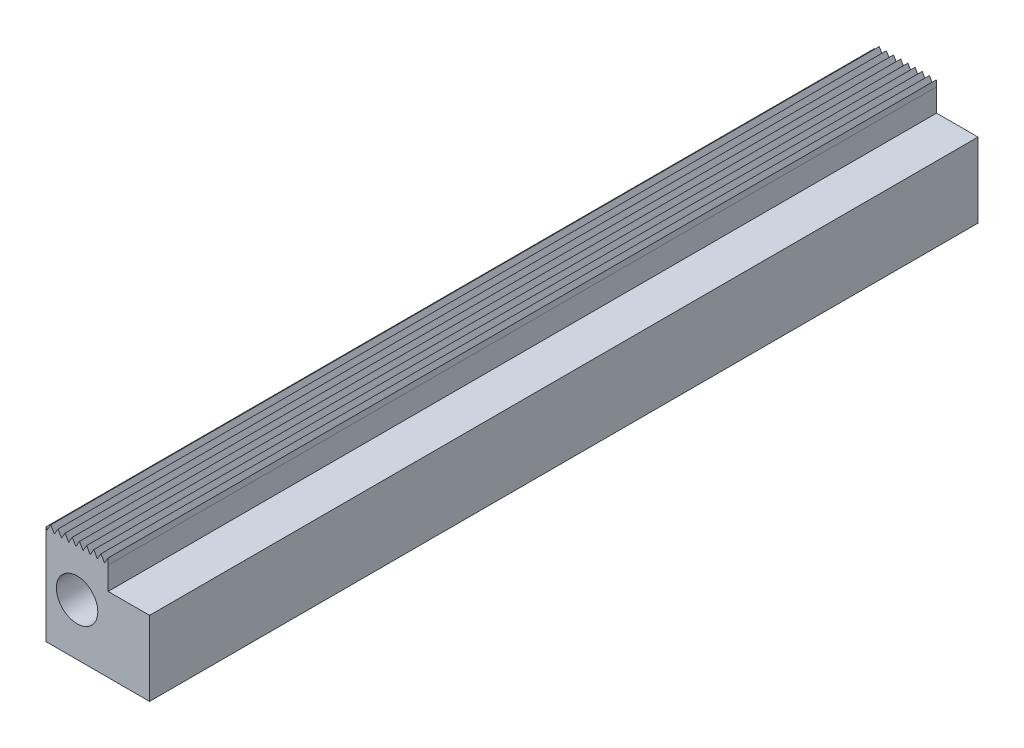
ISO-10303-21;
HEADER;
FILE_DESCRIPTION(('STEP AP214'),'2;1');
FILE_NAME('part.step','',(''),(''),'','','');
FILE_SCHEMA(('AUTOMOTIVE_DESIGN { 1 0 10303 214 1 1 1 1 }'));
ENDSEC;
DATA;
#1=APPLICATION_CONTEXT('core data for automotive mechanical design processes');
#2=APPLICATION_PROTOCOL_DEFINITION('international standard','automotive_design',2000,#1);
#3=PRODUCT_CONTEXT('',#1,'mechanical');
#4=PRODUCT('Part','Part','',(#3));
#5=PRODUCT_RELATED_PRODUCT_CATEGORY('part','',(#4));
#6=PRODUCT_DEFINITION_FORMATION('','',#4);
#7=PRODUCT_DEFINITION_CONTEXT('part definition',#1,'design');
#8=PRODUCT_DEFINITION('design','',#6,#7);
#9=PRODUCT_DEFINITION_SHAPE('','',#8);
#10=(LENGTH_UNIT() NAMED_UNIT(*) SI_UNIT(.MILLI.,.METRE.));
#11=(NAMED_UNIT(*) PLANE_ANGLE_UNIT() SI_UNIT($,.RADIAN.));
#12=(NAMED_UNIT(*) SI_UNIT($,.STERADIAN.) SOLID_ANGLE_UNIT());
#13=UNCERTAINTY_MEASURE_WITH_UNIT(LENGTH_MEASURE(1.E-05),#10,'distance_accuracy_value','');
#14=(GEOMETRIC_REPRESENTATION_CONTEXT(3) GLOBAL_UNCERTAINTY_ASSIGNED_CONTEXT((#13)) GLOBAL_UNIT_ASSIGNED_CONTEXT((#10,
#11,#12)) REPRESENTATION_CONTEXT('',''));
#15=CARTESIAN_POINT('',(0.,0.,0.));
#16=DIRECTION('',(0.,0.,1.));
#17=DIRECTION('',(1.,0.,0.));
#18=AXIS2_PLACEMENT_3D('',#15,#16,#17);
#19=CARTESIAN_POINT('',(-3.5384278264922,2.04291225813333,200.));
#20=DIRECTION('',(0.866025403784439,-0.5,0.));
#21=DIRECTION('',(0.5,0.866025403784439,0.));
#22=AXIS2_PLACEMENT_3D('',#19,#20,#21);
#23=PLANE('',#22);
#24=DIRECTION('',(-0.5,-0.866025403784439,0.));
#25=VECTOR('',#24,1.);
#26=CARTESIAN_POINT('',(-3.5384278264922,2.04291225813333,0.));
#27=LINE('',#26,#25);
#28=CARTESIAN_POINT('',(2.49897459621371,12.4999999999994,0.));
#29=VERTEX_POINT('',#28);
#30=CARTESIAN_POINT('',(1.63397459621381,11.0017760514525,0.));
#31=VERTEX_POINT('',#30);
#32=EDGE_CURVE('E234',#29,#31,#27,.T.);
#33=ORIENTED_EDGE('',*,*,#32,.T.);
#34=DIRECTION('',(0.,0.,-1.));
#35=VECTOR('',#34,1.);
#36=CARTESIAN_POINT('',(1.63397459621381,11.0017760514525,200.));
#37=LINE('',#36,#35);
#38=CARTESIAN_POINT('',(1.63397459621381,11.0017760514525,200.));
#39=VERTEX_POINT('',#38);
#40=EDGE_CURVE('E11',#39,#31,#37,.T.);
#41=ORIENTED_EDGE('',*,*,#40,.F.);
#42=DIRECTION('',(-0.5,-0.866025403784439,0.));
#43=VECTOR('',#42,1.);
#44=CARTESIAN_POINT('',(-3.5384278264922,2.04291225813333,200.));
#45=LINE('',#44,#43);
#46=CARTESIAN_POINT('',(2.49897459621371,12.4999999999994,200.));
#47=VERTEX_POINT('',#46);
#48=EDGE_CURVE('E288',#47,#39,#45,.T.);
#49=ORIENTED_EDGE('',*,*,#48,.F.);
#50=DIRECTION('',(0.,0.,-1.));
#51=VECTOR('',#50,1.);
#52=CARTESIAN_POINT('',(2.49897459621371,12.4999999999994,200.));
#53=LINE('',#52,#51);
#54=EDGE_CURVE('E52',#47,#29,#53,.T.);
#55=ORIENTED_EDGE('',*,*,#54,.T.);
#56=EDGE_LOOP('',(#33,#41,#49,#55));
#57=FACE_BOUND('',#56,.T.);
#58=ADVANCED_FACE('F36',(#57),#23,.F.);
#59=CARTESIAN_POINT('',(5.98938972081292,3.45797576759291,200.));
#60=DIRECTION('',(-0.866025403784439,-0.5,0.));
#61=DIRECTION('',(0.5,-0.866025403784439,0.));
#62=AXIS2_PLACEMENT_3D('',#59,#60,#61);
#63=PLANE('',#62);
#64=DIRECTION('',(-0.5,0.866025403784439,0.));
#65=VECTOR('',#64,1.);
#66=CARTESIAN_POINT('',(5.98938972081292,3.45797576759291,0.));
#67=LINE('',#66,#65);
#68=CARTESIAN_POINT('',(0.768974596213909,12.4999999999994,0.));
#69=VERTEX_POINT('',#68);
#70=EDGE_CURVE('E236',#31,#69,#67,.T.);
#71=ORIENTED_EDGE('',*,*,#70,.T.);
#72=DIRECTION('',(0.,0.,-1.));
#73=VECTOR('',#72,1.);
#74=CARTESIAN_POINT('',(0.768974596213909,12.4999999999994,200.));
#75=LINE('',#74,#73);
#76=CARTESIAN_POINT('',(0.768974596213909,12.4999999999994,200.));
#77=VERTEX_POINT('',#76);
#78=EDGE_CURVE('E44',#77,#69,#75,.T.);
#79=ORIENTED_EDGE('',*,*,#78,.F.);
#80=DIRECTION('',(-0.5,0.866025403784439,0.));
#81=VECTOR('',#80,1.);
#82=CARTESIAN_POINT('',(5.98938972081292,3.45797576759291,200.));
#83=LINE('',#82,#81);
#84=EDGE_CURVE('E139',#39,#77,#83,.T.);
#85=ORIENTED_EDGE('',*,*,#84,.F.);
#86=ORIENTED_EDGE('',*,*,#40,.T.);
#87=EDGE_LOOP('',(#71,#79,#85,#86));
#88=FACE_BOUND('',#87,.T.);
#89=ADVANCED_FACE('F420',(#88),#63,.F.);
#90=CARTESIAN_POINT('',(-4.83592782649206,2.79202423240679,200.));
#91=DIRECTION('',(0.866025403784439,-0.5,0.));
#92=DIRECTION('',(0.5,0.866025403784439,0.));
#93=AXIS2_PLACEMENT_3D('',#90,#91,#92);
#94=PLANE('',#93);
#95=DIRECTION('',(-0.5,-0.866025403784439,0.));
#96=VECTOR('',#95,1.);
#97=CARTESIAN_POINT('',(-4.83592782649206,2.79202423240679,0.));
#98=LINE('',#97,#96);
#99=CARTESIAN_POINT('',(-0.0960254037859947,11.0017760514525,0.));
#100=VERTEX_POINT('',#99);
#101=EDGE_CURVE('E238',#69,#100,#98,.T.);
#102=ORIENTED_EDGE('',*,*,#101,.T.);
#103=DIRECTION('',(0.,0.,-1.));
#104=VECTOR('',#103,1.);
#105=CARTESIAN_POINT('',(-0.0960254037859947,11.0017760514525,200.));
#106=LINE('',#105,#104);
#107=CARTESIAN_POINT('',(-0.0960254037859947,11.0017760514525,200.));
#108=VERTEX_POINT('',#107);
#109=EDGE_CURVE('E341',#108,#100,#106,.T.);
#110=ORIENTED_EDGE('',*,*,#109,.F.);
#111=DIRECTION('',(-0.5,-0.866025403784439,0.));
#112=VECTOR('',#111,1.);
#113=CARTESIAN_POINT('',(-4.83592782649206,2.79202423240679,200.));
#114=LINE('',#113,#112);
#115=EDGE_CURVE('E349',#77,#108,#114,.T.);
#116=ORIENTED_EDGE('',*,*,#115,.F.);
#117=ORIENTED_EDGE('',*,*,#78,.T.);
#118=EDGE_LOOP('',(#102,#110,#116,#117));
#119=FACE_BOUND('',#118,.T.);
#120=ADVANCED_FACE('F347',(#119),#94,.F.);
#121=CARTESIAN_POINT('',(4.69188972081306,2.70886379331946,200.));
#122=DIRECTION('',(-0.866025403784439,-0.5,0.));
#123=DIRECTION('',(0.5,-0.866025403784439,0.));
#124=AXIS2_PLACEMENT_3D('',#121,#122,#123);
#125=PLANE('',#124);
#126=DIRECTION('',(-0.5,0.866025403784439,0.));
#127=VECTOR('',#126,1.);
#128=CARTESIAN_POINT('',(4.69188972081306,2.70886379331946,0.));
#129=LINE('',#128,#127);
#130=CARTESIAN_POINT('',(-0.961025403785894,12.4999999999994,0.));
#131=VERTEX_POINT('',#130);
#132=EDGE_CURVE('E240',#100,#131,#129,.T.);
#133=ORIENTED_EDGE('',*,*,#132,.T.);
#134=DIRECTION('',(0.,0.,-1.));
#135=VECTOR('',#134,1.);
#136=CARTESIAN_POINT('',(-0.961025403785894,12.4999999999994,200.));
#137=LINE('',#136,#135);
#138=CARTESIAN_POINT('',(-0.961025403785894,12.4999999999994,200.));
#139=VERTEX_POINT('',#138);
#140=EDGE_CURVE('E338',#139,#131,#137,.T.);
#141=ORIENTED_EDGE('',*,*,#140,.F.);
#142=DIRECTION('',(-0.5,0.866025403784439,0.));
#143=VECTOR('',#142,1.);
#144=CARTESIAN_POINT('',(4.69188972081306,2.70886379331946,200.));
#145=LINE('',#144,#143);
#146=EDGE_CURVE('E367',#108,#139,#145,.T.);
#147=ORIENTED_EDGE('',*,*,#146,.F.);
#148=ORIENTED_EDGE('',*,*,#109,.T.);
#149=EDGE_LOOP('',(#133,#141,#147,#148));
#150=FACE_BOUND('',#149,.T.);
#151=ADVANCED_FACE('F358',(#150),#125,.F.);
#152=CARTESIAN_POINT('',(-6.13342782649191,3.54113620668025,200.));
#153=DIRECTION('',(0.866025403784439,-0.5,0.));
#154=DIRECTION('',(0.5,0.866025403784439,0.));
#155=AXIS2_PLACEMENT_3D('',#152,#153,#154);
#156=PLANE('',#155);
#157=DIRECTION('',(-0.5,-0.866025403784439,0.));
#158=VECTOR('',#157,1.);
#159=CARTESIAN_POINT('',(-6.13342782649191,3.54113620668025,0.));
#160=LINE('',#159,#158);
#161=CARTESIAN_POINT('',(-1.82602540378581,11.0017760514525,0.));
#162=VERTEX_POINT('',#161);
#163=EDGE_CURVE('E242',#131,#162,#160,.T.);
#164=ORIENTED_EDGE('',*,*,#163,.T.);
#165=DIRECTION('',(0.,0.,-1.));
#166=VECTOR('',#165,1.);
#167=CARTESIAN_POINT('',(-1.82602540378581,11.0017760514525,200.));
#168=LINE('',#167,#166);
#169=CARTESIAN_POINT('',(-1.82602540378581,11.0017760514525,200.));
#170=VERTEX_POINT('',#169);
#171=EDGE_CURVE('E335',#170,#162,#168,.T.);
#172=ORIENTED_EDGE('',*,*,#171,.F.);
#173=DIRECTION('',(-0.5,-0.866025403784439,0.));
#174=VECTOR('',#173,1.);
#175=CARTESIAN_POINT('',(-6.13342782649191,3.54113620668025,200.));
#176=LINE('',#175,#174);
#177=EDGE_CURVE('E364',#139,#170,#176,.T.);
#178=ORIENTED_EDGE('',*,*,#177,.F.);
#179=ORIENTED_EDGE('',*,*,#140,.T.);
#180=EDGE_LOOP('',(#164,#172,#178,#179));
#181=FACE_BOUND('',#180,.T.);
#182=ADVANCED_FACE('F362',(#181),#156,.F.);
#183=CARTESIAN_POINT('',(3.3943897208132,1.959751819046,200.));
#184=DIRECTION('',(-0.866025403784439,-0.5,0.));
#185=DIRECTION('',(0.5,-0.866025403784439,0.));
#186=AXIS2_PLACEMENT_3D('',#183,#184,#185);
#187=PLANE('',#186);
#188=DIRECTION('',(-0.5,0.866025403784439,0.));
#189=VECTOR('',#188,1.);
#190=CARTESIAN_POINT('',(3.3943897208132,1.959751819046,0.));
#191=LINE('',#190,#189);
#192=CARTESIAN_POINT('',(-2.69102540378571,12.4999999999994,0.));
#193=VERTEX_POINT('',#192);
#194=EDGE_CURVE('E244',#162,#193,#191,.T.);
#195=ORIENTED_EDGE('',*,*,#194,.T.);
#196=DIRECTION('',(0.,0.,-1.));
#197=VECTOR('',#196,1.);
#198=CARTESIAN_POINT('',(-2.69102540378571,12.4999999999994,200.));
#199=LINE('',#198,#197);
#200=CARTESIAN_POINT('',(-2.69102540378571,12.4999999999994,200.));
#201=VERTEX_POINT('',#200);
#202=EDGE_CURVE('E332',#201,#193,#199,.T.);
#203=ORIENTED_EDGE('',*,*,#202,.F.);
#204=DIRECTION('',(-0.5,0.866025403784439,0.));
#205=VECTOR('',#204,1.);
#206=CARTESIAN_POINT('',(3.3943897208132,1.959751819046,200.));
#207=LINE('',#206,#205);
#208=EDGE_CURVE('E366',#170,#201,#207,.T.);
#209=ORIENTED_EDGE('',*,*,#208,.F.);
#210=ORIENTED_EDGE('',*,*,#171,.T.);
#211=EDGE_LOOP('',(#195,#203,#209,#210));
#212=FACE_BOUND('',#211,.T.);
#213=ADVANCED_FACE('F436',(#212),#187,.F.);
#214=CARTESIAN_POINT('',(-7.43092782649176,4.2902481809537,200.));
#215=DIRECTION('',(0.866025403784439,-0.5,0.));
#216=DIRECTION('',(0.5,0.866025403784439,0.));
#217=AXIS2_PLACEMENT_3D('',#214,#215,#216);
#218=PLANE('',#217);
#219=DIRECTION('',(-0.5,-0.866025403784439,0.));
#220=VECTOR('',#219,1.);
#221=CARTESIAN_POINT('',(-7.43092782649176,4.2902481809537,0.));
#222=LINE('',#221,#220);
#223=CARTESIAN_POINT('',(-3.55602540378562,11.0017760514525,0.));
#224=VERTEX_POINT('',#223);
#225=EDGE_CURVE('E246',#193,#224,#222,.T.);
#226=ORIENTED_EDGE('',*,*,#225,.T.);
#227=DIRECTION('',(0.,0.,-1.));
#228=VECTOR('',#227,1.);
#229=CARTESIAN_POINT('',(-3.55602540378562,11.0017760514525,200.));
#230=LINE('',#229,#228);
#231=CARTESIAN_POINT('',(-3.55602540378562,11.0017760514525,200.));
#232=VERTEX_POINT('',#231);
#233=EDGE_CURVE('E329',#232,#224,#230,.T.);
#234=ORIENTED_EDGE('',*,*,#233,.F.);
#235=DIRECTION('',(-0.5,-0.866025403784439,0.));
#236=VECTOR('',#235,1.);
#237=CARTESIAN_POINT('',(-7.43092782649176,4.2902481809537,200.));
#238=LINE('',#237,#236);
#239=EDGE_CURVE('E369',#201,#232,#238,.T.);
#240=ORIENTED_EDGE('',*,*,#239,.F.);
#241=ORIENTED_EDGE('',*,*,#202,.T.);
#242=EDGE_LOOP('',(#226,#234,#240,#241));
#243=FACE_BOUND('',#242,.T.);
#244=ADVANCED_FACE('F439',(#243),#218,.F.);
#245=CARTESIAN_POINT('',(2.09688972081334,1.21063984477254,200.));
#246=DIRECTION('',(-0.866025403784439,-0.5,0.));
#247=DIRECTION('',(0.5,-0.866025403784439,0.));
#248=AXIS2_PLACEMENT_3D('',#245,#246,#247);
#249=PLANE('',#248);
#250=DIRECTION('',(-0.5,0.866025403784439,0.));
#251=VECTOR('',#250,1.);
#252=CARTESIAN_POINT('',(2.09688972081334,1.21063984477254,0.));
#253=LINE('',#252,#251);
#254=CARTESIAN_POINT('',(-4.42102540378552,12.4999999999994,0.));
#255=VERTEX_POINT('',#254);
#256=EDGE_CURVE('E248',#224,#255,#253,.T.);
#257=ORIENTED_EDGE('',*,*,#256,.T.);
#258=DIRECTION('',(0.,0.,-1.));
#259=VECTOR('',#258,1.);
#260=CARTESIAN_POINT('',(-4.42102540378552,12.4999999999994,200.));
#261=LINE('',#260,#259);
#262=CARTESIAN_POINT('',(-4.42102540378552,12.4999999999994,200.));
#263=VERTEX_POINT('',#262);
#264=EDGE_CURVE('E326',#263,#255,#261,.T.);
#265=ORIENTED_EDGE('',*,*,#264,.F.);
#266=DIRECTION('',(-0.5,0.866025403784439,0.));
#267=VECTOR('',#266,1.);
#268=CARTESIAN_POINT('',(2.09688972081334,1.21063984477254,200.));
#269=LINE('',#268,#267);
#270=EDGE_CURVE('E375',#232,#263,#269,.T.);
#271=ORIENTED_EDGE('',*,*,#270,.F.);
#272=ORIENTED_EDGE('',*,*,#233,.T.);
#273=EDGE_LOOP('',(#257,#265,#271,#272));
#274=FACE_BOUND('',#273,.T.);
#275=ADVANCED_FACE('F443',(#274),#249,.F.);
#276=CARTESIAN_POINT('',(-8.72842782649161,5.03936015522715,200.));
#277=DIRECTION('',(0.866025403784439,-0.5,0.));
#278=DIRECTION('',(0.5,0.866025403784439,0.));
#279=AXIS2_PLACEMENT_3D('',#276,#277,#278);
#280=PLANE('',#279);
#281=DIRECTION('',(-0.5,-0.866025403784439,0.));
#282=VECTOR('',#281,1.);
#283=CARTESIAN_POINT('',(-8.72842782649161,5.03936015522715,0.));
#284=LINE('',#283,#282);
#285=CARTESIAN_POINT('',(-5.28602540378543,11.0017760514525,0.));
#286=VERTEX_POINT('',#285);
#287=EDGE_CURVE('E250',#255,#286,#284,.T.);
#288=ORIENTED_EDGE('',*,*,#287,.T.);
#289=DIRECTION('',(0.,0.,-1.));
#290=VECTOR('',#289,1.);
#291=CARTESIAN_POINT('',(-5.28602540378543,11.0017760514525,200.));
#292=LINE('',#291,#290);
#293=CARTESIAN_POINT('',(-5.28602540378543,11.0017760514525,200.));
#294=VERTEX_POINT('',#293);
#295=EDGE_CURVE('E323',#294,#286,#292,.T.);
#296=ORIENTED_EDGE('',*,*,#295,.F.);
#297=DIRECTION('',(-0.5,-0.866025403784439,0.));
#298=VECTOR('',#297,1.);
#299=CARTESIAN_POINT('',(-8.72842782649161,5.03936015522715,200.));
#300=LINE('',#299,#298);
#301=EDGE_CURVE('E377',#263,#294,#300,.T.);
#302=ORIENTED_EDGE('',*,*,#301,.F.);
#303=ORIENTED_EDGE('',*,*,#264,.T.);
#304=EDGE_LOOP('',(#288,#296,#302,#303));
#305=FACE_BOUND('',#304,.T.);
#306=ADVANCED_FACE('F447',(#305),#280,.F.);
#307=CARTESIAN_POINT('',(0.799389720813473,0.461527870499078,200.));
#308=DIRECTION('',(-0.866025403784439,-0.5,0.));
#309=DIRECTION('',(0.5,-0.866025403784439,0.));
#310=AXIS2_PLACEMENT_3D('',#307,#308,#309);
#311=PLANE('',#310);
#312=DIRECTION('',(-0.5,0.866025403784439,0.));
#313=VECTOR('',#312,1.);
#314=CARTESIAN_POINT('',(0.799389720813473,0.461527870499078,0.));
#315=LINE('',#314,#313);
#316=CARTESIAN_POINT('',(-6.15102540378533,12.4999999999994,0.));
#317=VERTEX_POINT('',#316);
#318=EDGE_CURVE('E252',#286,#317,#315,.T.);
#319=ORIENTED_EDGE('',*,*,#318,.T.);
#320=DIRECTION('',(0.,0.,-1.));
#321=VECTOR('',#320,1.);
#322=CARTESIAN_POINT('',(-6.15102540378533,12.4999999999994,200.));
#323=LINE('',#322,#321);
#324=CARTESIAN_POINT('',(-6.15102540378533,12.4999999999994,200.));
#325=VERTEX_POINT('',#324);
#326=EDGE_CURVE('E320',#325,#317,#323,.T.);
#327=ORIENTED_EDGE('',*,*,#326,.F.);
#328=DIRECTION('',(-0.5,0.866025403784439,0.));
#329=VECTOR('',#328,1.);
#330=CARTESIAN_POINT('',(0.799389720813473,0.461527870499078,200.));
#331=LINE('',#330,#329);
#332=EDGE_CURVE('E379',#294,#325,#331,.T.);
#333=ORIENTED_EDGE('',*,*,#332,.F.);
#334=ORIENTED_EDGE('',*,*,#295,.T.);
#335=EDGE_LOOP('',(#319,#327,#333,#334));
#336=FACE_BOUND('',#335,.T.);
#337=ADVANCED_FACE('F451',(#336),#311,.F.);
#338=CARTESIAN_POINT('',(-10.0259278264915,5.78847212950061,200.));
#339=DIRECTION('',(0.866025403784439,-0.5,0.));
#340=DIRECTION('',(0.5,0.866025403784439,0.));
#341=AXIS2_PLACEMENT_3D('',#338,#339,#340);
#342=PLANE('',#341);
#343=DIRECTION('',(-0.5,-0.866025403784439,0.));
#344=VECTOR('',#343,1.);
#345=CARTESIAN_POINT('',(-10.0259278264915,5.78847212950061,0.));
#346=LINE('',#345,#344);
#347=CARTESIAN_POINT('',(-7.01602540378524,11.0017760514525,0.));
#348=VERTEX_POINT('',#347);
#349=EDGE_CURVE('E254',#317,#348,#346,.T.);
#350=ORIENTED_EDGE('',*,*,#349,.T.);
#351=DIRECTION('',(0.,0.,-1.));
#352=VECTOR('',#351,1.);
#353=CARTESIAN_POINT('',(-7.01602540378524,11.0017760514525,200.));
#354=LINE('',#353,#352);
#355=CARTESIAN_POINT('',(-7.01602540378524,11.0017760514525,200.));
#356=VERTEX_POINT('',#355);
#357=EDGE_CURVE('E317',#356,#348,#354,.T.);
#358=ORIENTED_EDGE('',*,*,#357,.F.);
#359=DIRECTION('',(-0.5,-0.866025403784439,0.));
#360=VECTOR('',#359,1.);
#361=CARTESIAN_POINT('',(-10.0259278264915,5.78847212950061,200.));
#362=LINE('',#361,#360);
#363=EDGE_CURVE('E381',#325,#356,#362,.T.);
#364=ORIENTED_EDGE('',*,*,#363,.F.);
#365=ORIENTED_EDGE('',*,*,#326,.T.);
#366=EDGE_LOOP('',(#350,#358,#364,#365));
#367=FACE_BOUND('',#366,.T.);
#368=ADVANCED_FACE('F455',(#367),#342,.F.);
#369=CARTESIAN_POINT('',(-0.49811027918639,-0.287584103774382,200.));
#370=DIRECTION('',(-0.866025403784439,-0.5,0.));
#371=DIRECTION('',(0.5,-0.866025403784439,0.));
#372=AXIS2_PLACEMENT_3D('',#369,#370,#371);
#373=PLANE('',#372);
#374=DIRECTION('',(-0.5,0.866025403784439,0.));
#375=VECTOR('',#374,1.);
#376=CARTESIAN_POINT('',(-0.49811027918639,-0.287584103774382,0.));
#377=LINE('',#376,#375);
#378=CARTESIAN_POINT('',(-7.88102540378514,12.4999999999994,0.));
#379=VERTEX_POINT('',#378);
#380=EDGE_CURVE('E256',#348,#379,#377,.T.);
#381=ORIENTED_EDGE('',*,*,#380,.T.);
#382=DIRECTION('',(0.,0.,-1.));
#383=VECTOR('',#382,1.);
#384=CARTESIAN_POINT('',(-7.88102540378514,12.4999999999994,200.));
#385=LINE('',#384,#383);
#386=CARTESIAN_POINT('',(-7.88102540378514,12.4999999999994,200.));
#387=VERTEX_POINT('',#386);
#388=EDGE_CURVE('E314',#387,#379,#385,.T.);
#389=ORIENTED_EDGE('',*,*,#388,.F.);
#390=DIRECTION('',(-0.5,0.866025403784439,0.));
#391=VECTOR('',#390,1.);
#392=CARTESIAN_POINT('',(-0.49811027918639,-0.287584103774382,200.));
#393=LINE('',#392,#391);
#394=EDGE_CURVE('E383',#356,#387,#393,.T.);
#395=ORIENTED_EDGE('',*,*,#394,.F.);
#396=ORIENTED_EDGE('',*,*,#357,.T.);
#397=EDGE_LOOP('',(#381,#389,#395,#396));
#398=FACE_BOUND('',#397,.T.);
#399=ADVANCED_FACE('F459',(#398),#373,.F.);
#400=CARTESIAN_POINT('',(-11.3234278264913,6.53758410377406,200.));
#401=DIRECTION('',(0.866025403784439,-0.5,0.));
#402=DIRECTION('',(0.5,0.866025403784439,0.));
#403=AXIS2_PLACEMENT_3D('',#400,#401,#402);
#404=PLANE('',#403);
#405=DIRECTION('',(-0.5,-0.866025403784439,0.));
#406=VECTOR('',#405,1.);
#407=CARTESIAN_POINT('',(-11.3234278264913,6.53758410377406,0.));
#408=LINE('',#407,#406);
#409=CARTESIAN_POINT('',(-8.74602540378505,11.0017760514524,0.));
#410=VERTEX_POINT('',#409);
#411=EDGE_CURVE('E258',#379,#410,#408,.T.);
#412=ORIENTED_EDGE('',*,*,#411,.T.);
#413=DIRECTION('',(0.,0.,-1.));
#414=VECTOR('',#413,1.);
#415=CARTESIAN_POINT('',(-8.74602540378505,11.0017760514524,200.));
#416=LINE('',#415,#414);
#417=CARTESIAN_POINT('',(-8.74602540378505,11.0017760514524,200.));
#418=VERTEX_POINT('',#417);
#419=EDGE_CURVE('E311',#418,#410,#416,.T.);
#420=ORIENTED_EDGE('',*,*,#419,.F.);
#421=DIRECTION('',(-0.5,-0.866025403784439,0.));
#422=VECTOR('',#421,1.);
#423=CARTESIAN_POINT('',(-11.3234278264913,6.53758410377406,200.));
#424=LINE('',#423,#422);
#425=EDGE_CURVE('E385',#387,#418,#424,.T.);
#426=ORIENTED_EDGE('',*,*,#425,.F.);
#427=ORIENTED_EDGE('',*,*,#388,.T.);
#428=EDGE_LOOP('',(#412,#420,#426,#427));
#429=FACE_BOUND('',#428,.T.);
#430=ADVANCED_FACE('F463',(#429),#404,.F.);
#431=CARTESIAN_POINT('',(-1.79561027918625,-1.03669607804784,200.));
#432=DIRECTION('',(-0.866025403784439,-0.5,0.));
#433=DIRECTION('',(0.5,-0.866025403784439,0.));
#434=AXIS2_PLACEMENT_3D('',#431,#432,#433);
#435=PLANE('',#434);
#436=DIRECTION('',(-0.5,0.866025403784439,0.));
#437=VECTOR('',#436,1.);
#438=CARTESIAN_POINT('',(-1.79561027918625,-1.03669607804784,0.));
#439=LINE('',#438,#437);
#440=CARTESIAN_POINT('',(-9.61102540378495,12.4999999999993,0.));
#441=VERTEX_POINT('',#440);
#442=EDGE_CURVE('E260',#410,#441,#439,.T.);
#443=ORIENTED_EDGE('',*,*,#442,.T.);
#444=DIRECTION('',(0.,0.,-1.));
#445=VECTOR('',#444,1.);
#446=CARTESIAN_POINT('',(-9.61102540378495,12.4999999999993,200.));
#447=LINE('',#446,#445);
#448=CARTESIAN_POINT('',(-9.61102540378495,12.4999999999993,200.));
#449=VERTEX_POINT('',#448);
#450=EDGE_CURVE('E308',#449,#441,#447,.T.);
#451=ORIENTED_EDGE('',*,*,#450,.F.);
#452=DIRECTION('',(-0.5,0.866025403784439,0.));
#453=VECTOR('',#452,1.);
#454=CARTESIAN_POINT('',(-1.79561027918625,-1.03669607804784,200.));
#455=LINE('',#454,#453);
#456=EDGE_CURVE('E387',#418,#449,#455,.T.);
#457=ORIENTED_EDGE('',*,*,#456,.F.);
#458=ORIENTED_EDGE('',*,*,#419,.T.);
#459=EDGE_LOOP('',(#443,#451,#457,#458));
#460=FACE_BOUND('',#459,.T.);
#461=ADVANCED_FACE('F467',(#460),#435,.F.);
#462=CARTESIAN_POINT('',(-12.6209278264912,7.28669607804751,200.));
#463=DIRECTION('',(0.866025403784439,-0.5,0.));
#464=DIRECTION('',(0.5,0.866025403784439,0.));
#465=AXIS2_PLACEMENT_3D('',#462,#463,#464);
#466=PLANE('',#465);
#467=DIRECTION('',(-0.5,-0.866025403784439,0.));
#468=VECTOR('',#467,1.);
#469=CARTESIAN_POINT('',(-12.6209278264912,7.28669607804751,0.));
#470=LINE('',#469,#468);
#471=CARTESIAN_POINT('',(-10.476025403785,11.0017760514523,0.));
#472=VERTEX_POINT('',#471);
#473=EDGE_CURVE('E262',#441,#472,#470,.T.);
#474=ORIENTED_EDGE('',*,*,#473,.T.);
#475=DIRECTION('',(0.,0.,-1.));
#476=VECTOR('',#475,1.);
#477=CARTESIAN_POINT('',(-10.476025403785,11.0017760514523,200.));
#478=LINE('',#477,#476);
#479=CARTESIAN_POINT('',(-10.476025403785,11.0017760514523,200.));
#480=VERTEX_POINT('',#479);
#481=EDGE_CURVE('E305',#480,#472,#478,.T.);
#482=ORIENTED_EDGE('',*,*,#481,.F.);
#483=DIRECTION('',(-0.5,-0.866025403784439,0.));
#484=VECTOR('',#483,1.);
#485=CARTESIAN_POINT('',(-12.6209278264912,7.28669607804751,200.));
#486=LINE('',#485,#484);
#487=EDGE_CURVE('E389',#449,#480,#486,.T.);
#488=ORIENTED_EDGE('',*,*,#487,.F.);
#489=ORIENTED_EDGE('',*,*,#450,.T.);
#490=EDGE_LOOP('',(#474,#482,#488,#489));
#491=FACE_BOUND('',#490,.T.);
#492=ADVANCED_FACE('F471',(#491),#466,.F.);
#493=CARTESIAN_POINT('',(-3.09311027918626,-1.78580805232139,200.));
#494=DIRECTION('',(-0.866025403784439,-0.5,0.));
#495=DIRECTION('',(0.5,-0.866025403784439,0.));
#496=AXIS2_PLACEMENT_3D('',#493,#494,#495);
#497=PLANE('',#496);
#498=DIRECTION('',(-0.5,0.866025403784439,0.));
#499=VECTOR('',#498,1.);
#500=CARTESIAN_POINT('',(-3.09311027918626,-1.78580805232139,0.));
#501=LINE('',#500,#499);
#502=CARTESIAN_POINT('',(-11.3410254037849,12.4999999999992,0.));
#503=VERTEX_POINT('',#502);
#504=EDGE_CURVE('E264',#472,#503,#501,.T.);
#505=ORIENTED_EDGE('',*,*,#504,.T.);
#506=DIRECTION('',(0.,0.,-1.));
#507=VECTOR('',#506,1.);
#508=CARTESIAN_POINT('',(-11.3410254037849,12.4999999999992,200.));
#509=LINE('',#508,#507);
#510=CARTESIAN_POINT('',(-11.3410254037849,12.4999999999992,200.));
#511=VERTEX_POINT('',#510);
#512=EDGE_CURVE('E302',#511,#503,#509,.T.);
#513=ORIENTED_EDGE('',*,*,#512,.F.);
#514=DIRECTION('',(-0.5,0.866025403784439,0.));
#515=VECTOR('',#514,1.);
#516=CARTESIAN_POINT('',(-3.09311027918626,-1.78580805232139,200.));
#517=LINE('',#516,#515);
#518=EDGE_CURVE('E391',#480,#511,#517,.T.);
#519=ORIENTED_EDGE('',*,*,#518,.F.);
#520=ORIENTED_EDGE('',*,*,#481,.T.);
#521=EDGE_LOOP('',(#505,#513,#519,#520));
#522=FACE_BOUND('',#521,.T.);
#523=ADVANCED_FACE('F475',(#522),#497,.F.);
#524=CARTESIAN_POINT('',(-13.918427826491,8.03580805232097,200.));
#525=DIRECTION('',(0.866025403784438,-0.5,0.));
#526=DIRECTION('',(0.5,0.866025403784439,0.));
#527=AXIS2_PLACEMENT_3D('',#524,#525,#526);
#528=PLANE('',#527);
#529=DIRECTION('',(-0.5,-0.866025403784439,0.));
#530=VECTOR('',#529,1.);
#531=CARTESIAN_POINT('',(-13.918427826491,8.03580805232097,0.));
#532=LINE('',#531,#530);
#533=CARTESIAN_POINT('',(-12.2060254037849,11.0017760514521,0.));
#534=VERTEX_POINT('',#533);
#535=EDGE_CURVE('E266',#503,#534,#532,.T.);
#536=ORIENTED_EDGE('',*,*,#535,.T.);
#537=DIRECTION('',(0.,0.,-1.));
#538=VECTOR('',#537,1.);
#539=CARTESIAN_POINT('',(-12.2060254037849,11.0017760514521,200.));
#540=LINE('',#539,#538);
#541=CARTESIAN_POINT('',(-12.2060254037849,11.0017760514521,200.));
#542=VERTEX_POINT('',#541);
#543=EDGE_CURVE('E299',#542,#534,#540,.T.);
#544=ORIENTED_EDGE('',*,*,#543,.F.);
#545=DIRECTION('',(-0.5,-0.866025403784439,0.));
#546=VECTOR('',#545,1.);
#547=CARTESIAN_POINT('',(-13.918427826491,8.03580805232097,200.));
#548=LINE('',#547,#546);
#549=EDGE_CURVE('E393',#511,#542,#548,.T.);
#550=ORIENTED_EDGE('',*,*,#549,.F.);
#551=ORIENTED_EDGE('',*,*,#512,.T.);
#552=EDGE_LOOP('',(#536,#544,#550,#551));
#553=FACE_BOUND('',#552,.T.);
#554=ADVANCED_FACE('F479',(#553),#528,.F.);
#555=CARTESIAN_POINT('',(-4.3906102791861,-2.53492002659489,200.));
#556=DIRECTION('',(-0.866025403784433,-0.500000000000009,0.));
#557=DIRECTION('',(0.500000000000009,-0.866025403784434,0.));
#558=AXIS2_PLACEMENT_3D('',#555,#556,#557);
#559=PLANE('',#558);
#560=DIRECTION('',(-0.500000000000009,0.866025403784434,0.));
#561=VECTOR('',#560,1.);
#562=CARTESIAN_POINT('',(-4.3906102791861,-2.53492002659489,0.));
#563=LINE('',#562,#561);
#564=CARTESIAN_POINT('',(-12.5,11.5109549882312,0.));
#565=VERTEX_POINT('',#564);
#566=EDGE_CURVE('E268',#534,#565,#563,.T.);
#567=ORIENTED_EDGE('',*,*,#566,.T.);
#568=DIRECTION('',(0.,0.,-1.));
#569=VECTOR('',#568,1.);
#570=CARTESIAN_POINT('',(-12.5,11.5109549882312,200.));
#571=LINE('',#570,#569);
#572=CARTESIAN_POINT('',(-12.5,11.5109549882312,200.));
#573=VERTEX_POINT('',#572);
#574=EDGE_CURVE('E297',#573,#565,#571,.T.);
#575=ORIENTED_EDGE('',*,*,#574,.F.);
#576=DIRECTION('',(-0.500000000000009,0.866025403784434,0.));
#577=VECTOR('',#576,1.);
#578=CARTESIAN_POINT('',(-4.3906102791861,-2.53492002659489,200.));
#579=LINE('',#578,#577);
#580=EDGE_CURVE('E395',#542,#573,#579,.T.);
#581=ORIENTED_EDGE('',*,*,#580,.F.);
#582=ORIENTED_EDGE('',*,*,#543,.T.);
#583=EDGE_LOOP('',(#567,#575,#581,#582));
#584=FACE_BOUND('',#583,.T.);
#585=ADVANCED_FACE('F483',(#584),#559,.F.);
#586=CARTESIAN_POINT('',(-12.5,0.,200.));
#587=DIRECTION('',(-1.,0.,0.));
#588=DIRECTION('',(0.,-1.,0.));
#589=AXIS2_PLACEMENT_3D('',#586,#587,#588);
#590=PLANE('',#589);
#591=DIRECTION('',(0.,1.,0.));
#592=VECTOR('',#591,1.);
#593=CARTESIAN_POINT('',(-12.5,0.,0.));
#594=LINE('',#593,#592);
#595=CARTESIAN_POINT('',(-12.5,-12.5,0.));
#596=VERTEX_POINT('',#595);
#597=EDGE_CURVE('E271',#596,#565,#594,.T.);
#598=ORIENTED_EDGE('',*,*,#597,.F.);
#599=DIRECTION('',(0.,0.,-1.));
#600=VECTOR('',#599,1.);
#601=CARTESIAN_POINT('',(-12.5,-12.5,200.));
#602=LINE('',#601,#600);
#603=CARTESIAN_POINT('',(-12.5,-12.5,200.));
#604=VERTEX_POINT('',#603);
#605=EDGE_CURVE('E295',#604,#596,#602,.T.);
#606=ORIENTED_EDGE('',*,*,#605,.F.);
#607=DIRECTION('',(0.,1.,0.));
#608=VECTOR('',#607,1.);
#609=CARTESIAN_POINT('',(-12.5,0.,200.));
#610=LINE('',#609,#608);
#611=EDGE_CURVE('E397',#604,#573,#610,.T.);
#612=ORIENTED_EDGE('',*,*,#611,.T.);
#613=ORIENTED_EDGE('',*,*,#574,.T.);
#614=EDGE_LOOP('',(#598,#606,#612,#613));
#615=FACE_BOUND('',#614,.T.);
#616=ADVANCED_FACE('F487',(#615),#590,.T.);
#617=CARTESIAN_POINT('',(0.,-12.5,200.));
#618=DIRECTION('',(0.,1.,0.));
#619=DIRECTION('',(0.,0.,1.));
#620=AXIS2_PLACEMENT_3D('',#617,#618,#619);
#621=PLANE('',#620);
#622=DIRECTION('',(1.,0.,0.));
#623=VECTOR('',#622,1.);
#624=CARTESIAN_POINT('',(0.,-12.5,0.));
#625=LINE('',#624,#623);
#626=CARTESIAN_POINT('',(12.5,-12.5,0.));
#627=VERTEX_POINT('',#626);
#628=EDGE_CURVE('E274',#596,#627,#625,.T.);
#629=ORIENTED_EDGE('',*,*,#628,.T.);
#630=DIRECTION('',(0.,0.,-1.));
#631=VECTOR('',#630,1.);
#632=CARTESIAN_POINT('',(12.5,-12.5,200.));
#633=LINE('',#632,#631);
#634=CARTESIAN_POINT('',(12.5,-12.5,200.));
#635=VERTEX_POINT('',#634);
#636=EDGE_CURVE('E292',#635,#627,#633,.T.);
#637=ORIENTED_EDGE('',*,*,#636,.F.);
#638=DIRECTION('',(1.,0.,0.));
#639=VECTOR('',#638,1.);
#640=CARTESIAN_POINT('',(0.,-12.5,200.));
#641=LINE('',#640,#639);
#642=EDGE_CURVE('E226',#604,#635,#641,.T.);
#643=ORIENTED_EDGE('',*,*,#642,.F.);
#644=ORIENTED_EDGE('',*,*,#605,.T.);
#645=EDGE_LOOP('',(#629,#637,#643,#644));
#646=FACE_BOUND('',#645,.T.);
#647=ADVANCED_FACE('F403',(#646),#621,.F.);
#648=CARTESIAN_POINT('',(12.5,0.,200.));
#649=DIRECTION('',(-1.,0.,0.));
#650=DIRECTION('',(0.,0.,1.));
#651=AXIS2_PLACEMENT_3D('',#648,#649,#650);
#652=PLANE('',#651);
#653=DIRECTION('',(0.,1.,0.));
#654=VECTOR('',#653,1.);
#655=CARTESIAN_POINT('',(12.5,0.,0.));
#656=LINE('',#655,#654);
#657=CARTESIAN_POINT('',(12.5,5.5,0.));
#658=VERTEX_POINT('',#657);
#659=EDGE_CURVE('E276',#627,#658,#656,.T.);
#660=ORIENTED_EDGE('',*,*,#659,.T.);
#661=DIRECTION('',(0.,0.,-1.));
#662=VECTOR('',#661,1.);
#663=CARTESIAN_POINT('',(12.5,5.5,200.));
#664=LINE('',#663,#662);
#665=CARTESIAN_POINT('',(12.5,5.5,200.));
#666=VERTEX_POINT('',#665);
#667=EDGE_CURVE('E212',#666,#658,#664,.T.);
#668=ORIENTED_EDGE('',*,*,#667,.F.);
#669=DIRECTION('',(0.,1.,0.));
#670=VECTOR('',#669,1.);
#671=CARTESIAN_POINT('',(12.5,0.,200.));
#672=LINE('',#671,#670);
#673=EDGE_CURVE('E223',#635,#666,#672,.T.);
#674=ORIENTED_EDGE('',*,*,#673,.F.);
#675=ORIENTED_EDGE('',*,*,#636,.T.);
#676=EDGE_LOOP('',(#660,#668,#674,#675));
#677=FACE_BOUND('',#676,.T.);
#678=ADVANCED_FACE('F407',(#677),#652,.F.);
#679=CARTESIAN_POINT('',(0.,5.5,200.));
#680=DIRECTION('',(0.,1.,0.));
#681=DIRECTION('',(-1.,0.,0.));
#682=AXIS2_PLACEMENT_3D('',#679,#680,#681);
#683=PLANE('',#682);
#684=DIRECTION('',(1.,0.,0.));
#685=VECTOR('',#684,1.);
#686=CARTESIAN_POINT('',(0.,5.5,0.));
#687=LINE('',#686,#685);
#688=CARTESIAN_POINT('',(2.5,5.5,0.));
#689=VERTEX_POINT('',#688);
#690=EDGE_CURVE('E209',#689,#658,#687,.T.);
#691=ORIENTED_EDGE('',*,*,#690,.F.);
#692=DIRECTION('',(0.,0.,-1.));
#693=VECTOR('',#692,1.);
#694=CARTESIAN_POINT('',(2.5,5.5,200.));
#695=LINE('',#694,#693);
#696=CARTESIAN_POINT('',(2.5,5.5,200.));
#697=VERTEX_POINT('',#696);
#698=EDGE_CURVE('E203',#697,#689,#695,.T.);
#699=ORIENTED_EDGE('',*,*,#698,.F.);
#700=DIRECTION('',(1.,0.,0.));
#701=VECTOR('',#700,1.);
#702=CARTESIAN_POINT('',(0.,5.5,200.));
#703=LINE('',#702,#701);
#704=EDGE_CURVE('E207',#697,#666,#703,.T.);
#705=ORIENTED_EDGE('',*,*,#704,.T.);
#706=ORIENTED_EDGE('',*,*,#667,.T.);
#707=EDGE_LOOP('',(#691,#699,#705,#706));
#708=FACE_BOUND('',#707,.T.);
#709=ADVANCED_FACE('F205',(#708),#683,.T.);
#710=CARTESIAN_POINT('',(2.5,0.,200.));
#711=DIRECTION('',(-1.,0.,0.));
#712=DIRECTION('',(0.,0.,1.));
#713=AXIS2_PLACEMENT_3D('',#710,#711,#712);
#714=PLANE('',#713);
#715=DIRECTION('',(0.,1.,0.));
#716=VECTOR('',#715,1.);
#717=CARTESIAN_POINT('',(2.5,0.,0.));
#718=LINE('',#717,#716);
#719=CARTESIAN_POINT('',(2.5,10.9999999999988,0.));
#720=VERTEX_POINT('',#719);
#721=EDGE_CURVE('E280',#689,#720,#718,.T.);
#722=ORIENTED_EDGE('',*,*,#721,.T.);
#723=DIRECTION('',(0.,0.,-1.));
#724=VECTOR('',#723,1.);
#725=CARTESIAN_POINT('',(2.5,10.9999999999988,200.));
#726=LINE('',#725,#724);
#727=CARTESIAN_POINT('',(2.5,10.9999999999988,200.));
#728=VERTEX_POINT('',#727);
#729=EDGE_CURVE('E127',#728,#720,#726,.T.);
#730=ORIENTED_EDGE('',*,*,#729,.F.);
#731=DIRECTION('',(0.,1.,0.));
#732=VECTOR('',#731,1.);
#733=CARTESIAN_POINT('',(2.5,0.,200.));
#734=LINE('',#733,#732);
#735=EDGE_CURVE('E214',#697,#728,#734,.T.);
#736=ORIENTED_EDGE('',*,*,#735,.F.);
#737=ORIENTED_EDGE('',*,*,#698,.T.);
#738=EDGE_LOOP('',(#722,#730,#736,#737));
#739=FACE_BOUND('',#738,.T.);
#740=ADVANCED_FACE('F215',(#739),#714,.F.);
#741=CARTESIAN_POINT('',(2.50751845597163,0.00171414594596359,200.));
#742=DIRECTION('',(0.999999766343876,0.000683602364465424,0.));
#743=DIRECTION('',(-0.000683602364465424,0.999999766343876,0.));
#744=AXIS2_PLACEMENT_3D('',#741,#742,#743);
#745=PLANE('',#744);
#746=DIRECTION('',(0.000683602364465424,-0.999999766343876,0.));
#747=VECTOR('',#746,1.);
#748=CARTESIAN_POINT('',(2.50751845597163,0.00171414594596359,0.));
#749=LINE('',#748,#747);
#750=EDGE_CURVE('E282',#29,#720,#749,.T.);
#751=ORIENTED_EDGE('',*,*,#750,.F.);
#752=ORIENTED_EDGE('',*,*,#54,.F.);
#753=DIRECTION('',(0.000683602364465424,-0.999999766343876,0.));
#754=VECTOR('',#753,1.);
#755=CARTESIAN_POINT('',(2.50751845597163,0.00171414594596359,200.));
#756=LINE('',#755,#754);
#757=EDGE_CURVE('E218',#47,#728,#756,.T.);
#758=ORIENTED_EDGE('',*,*,#757,.T.);
#759=ORIENTED_EDGE('',*,*,#729,.T.);
#760=EDGE_LOOP('',(#751,#752,#758,#759));
#761=FACE_BOUND('',#760,.T.);
#762=ADVANCED_FACE('F408',(#761),#745,.T.);
#763=CARTESIAN_POINT('',(-5.,0.,200.));
#764=DIRECTION('',(0.,0.,-1.));
#765=DIRECTION('',(-1.,0.,0.));
#766=AXIS2_PLACEMENT_3D('',#763,#764,#765);
#767=CYLINDRICAL_SURFACE('',#766,5.);
#768=CARTESIAN_POINT('',(-5.,0.,200.));
#769=DIRECTION('',(0.,0.,1.));
#770=DIRECTION('',(1.,0.,0.));
#771=AXIS2_PLACEMENT_3D('',#768,#769,#770);
#772=CIRCLE('',#771,5.);
#773=CARTESIAN_POINT('',(0.,0.,200.));
#774=VERTEX_POINT('',#773);
#775=EDGE_CURVE('E231',#774,#774,#772,.T.);
#776=ORIENTED_EDGE('',*,*,#775,.T.);
#777=EDGE_LOOP('',(#776));
#778=FACE_BOUND('',#777,.T.);
#779=CARTESIAN_POINT('',(-5.,0.,0.));
#780=DIRECTION('',(0.,0.,1.));
#781=DIRECTION('',(1.,0.,0.));
#782=AXIS2_PLACEMENT_3D('',#779,#780,#781);
#783=CIRCLE('',#782,5.);
#784=CARTESIAN_POINT('',(0.,0.,0.));
#785=VERTEX_POINT('',#784);
#786=EDGE_CURVE('E285',#785,#785,#783,.T.);
#787=ORIENTED_EDGE('',*,*,#786,.F.);
#788=EDGE_LOOP('',(#787));
#789=FACE_BOUND('',#788,.T.);
#790=ADVANCED_FACE('F410',(#778,#789),#767,.F.);
#791=CARTESIAN_POINT('',(0.,0.,200.));
#792=DIRECTION('',(0.,0.,1.));
#793=DIRECTION('',(1.,0.,0.));
#794=AXIS2_PLACEMENT_3D('',#791,#792,#793);
#795=PLANE('',#794);
#796=ORIENTED_EDGE('',*,*,#48,.T.);
#797=ORIENTED_EDGE('',*,*,#84,.T.);
#798=ORIENTED_EDGE('',*,*,#115,.T.);
#799=ORIENTED_EDGE('',*,*,#146,.T.);
#800=ORIENTED_EDGE('',*,*,#177,.T.);
#801=ORIENTED_EDGE('',*,*,#208,.T.);
#802=ORIENTED_EDGE('',*,*,#239,.T.);
#803=ORIENTED_EDGE('',*,*,#270,.T.);
#804=ORIENTED_EDGE('',*,*,#301,.T.);
#805=ORIENTED_EDGE('',*,*,#332,.T.);
#806=ORIENTED_EDGE('',*,*,#363,.T.);
#807=ORIENTED_EDGE('',*,*,#394,.T.);
#808=ORIENTED_EDGE('',*,*,#425,.T.);
#809=ORIENTED_EDGE('',*,*,#456,.T.);
#810=ORIENTED_EDGE('',*,*,#487,.T.);
#811=ORIENTED_EDGE('',*,*,#518,.T.);
#812=ORIENTED_EDGE('',*,*,#549,.T.);
#813=ORIENTED_EDGE('',*,*,#580,.T.);
#814=ORIENTED_EDGE('',*,*,#611,.F.);
#815=ORIENTED_EDGE('',*,*,#642,.T.);
#816=ORIENTED_EDGE('',*,*,#673,.T.);
#817=ORIENTED_EDGE('',*,*,#704,.F.);
#818=ORIENTED_EDGE('',*,*,#735,.T.);
#819=ORIENTED_EDGE('',*,*,#757,.F.);
#820=EDGE_LOOP('',(#796,#797,#798,#799,#800,#801,#802,#803,#804,#805,#806,#807,#808,#809,#810,
#811,#812,#813,#814,#815,#816,#817,#818,#819));
#821=FACE_BOUND('',#820,.T.);
#822=ORIENTED_EDGE('',*,*,#775,.F.);
#823=EDGE_LOOP('',(#822));
#824=FACE_BOUND('',#823,.T.);
#825=ADVANCED_FACE('F220',(#821,#824),#795,.T.);
#826=CARTESIAN_POINT('',(0.,0.,0.));
#827=DIRECTION('',(0.,0.,1.));
#828=DIRECTION('',(1.,0.,0.));
#829=AXIS2_PLACEMENT_3D('',#826,#827,#828);
#830=PLANE('',#829);
#831=ORIENTED_EDGE('',*,*,#32,.F.);
#832=ORIENTED_EDGE('',*,*,#750,.T.);
#833=ORIENTED_EDGE('',*,*,#721,.F.);
#834=ORIENTED_EDGE('',*,*,#690,.T.);
#835=ORIENTED_EDGE('',*,*,#659,.F.);
#836=ORIENTED_EDGE('',*,*,#628,.F.);
#837=ORIENTED_EDGE('',*,*,#597,.T.);
#838=ORIENTED_EDGE('',*,*,#566,.F.);
#839=ORIENTED_EDGE('',*,*,#535,.F.);
#840=ORIENTED_EDGE('',*,*,#504,.F.);
#841=ORIENTED_EDGE('',*,*,#473,.F.);
#842=ORIENTED_EDGE('',*,*,#442,.F.);
#843=ORIENTED_EDGE('',*,*,#411,.F.);
#844=ORIENTED_EDGE('',*,*,#380,.F.);
#845=ORIENTED_EDGE('',*,*,#349,.F.);
#846=ORIENTED_EDGE('',*,*,#318,.F.);
#847=ORIENTED_EDGE('',*,*,#287,.F.);
#848=ORIENTED_EDGE('',*,*,#256,.F.);
#849=ORIENTED_EDGE('',*,*,#225,.F.);
#850=ORIENTED_EDGE('',*,*,#194,.F.);
#851=ORIENTED_EDGE('',*,*,#163,.F.);
#852=ORIENTED_EDGE('',*,*,#132,.F.);
#853=ORIENTED_EDGE('',*,*,#101,.F.);
#854=ORIENTED_EDGE('',*,*,#70,.F.);
#855=EDGE_LOOP('',(#831,#832,#833,#834,#835,#836,#837,#838,#839,#840,#841,#842,#843,#844,#845,
#846,#847,#848,#849,#850,#851,#852,#853,#854));
#856=FACE_BOUND('',#855,.T.);
#857=ORIENTED_EDGE('',*,*,#786,.T.);
#858=EDGE_LOOP('',(#857));
#859=FACE_BOUND('',#858,.T.);
#860=ADVANCED_FACE('F352',(#856,#859),#830,.F.);
#861=CLOSED_SHELL('',(#58,#89,#120,#151,#182,#213,#244,#275,#306,#337,#368,#399,#430,#461,#492,
#523,#554,#585,#616,#647,#678,#709,#740,#762,#790,#825,#860));
#862=MANIFOLD_SOLID_BREP('B2',#861);
#863=ADVANCED_BREP_SHAPE_REPRESENTATION('',(#18,#862),#14);
#864=SHAPE_DEFINITION_REPRESENTATION(#9,#863);
ENDSEC;
END-ISO-10303-21;
